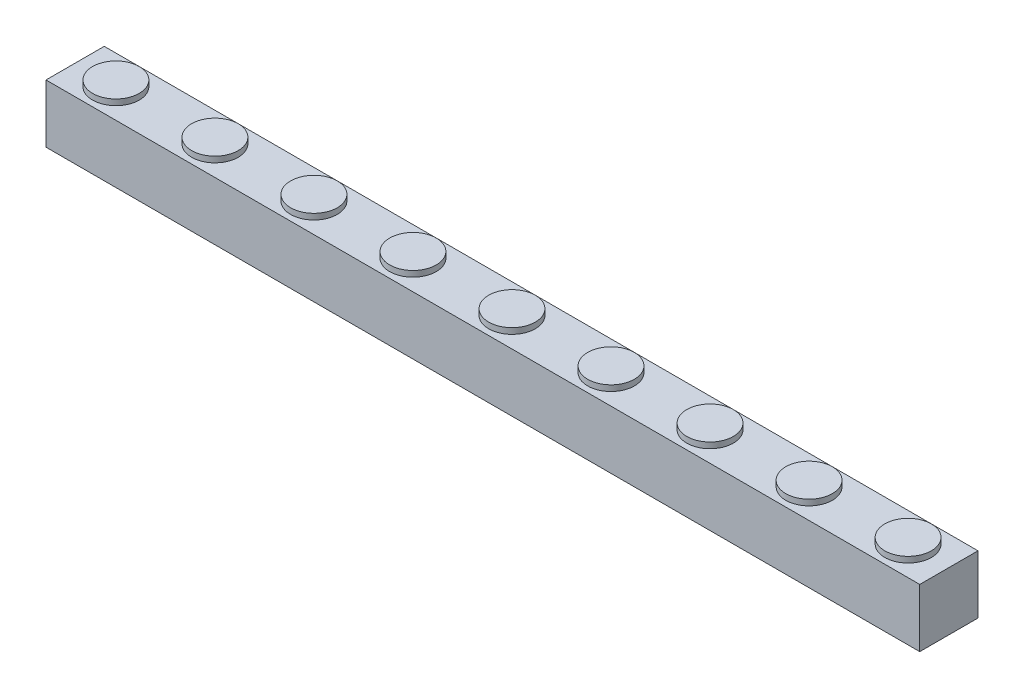
ISO-10303-21;
HEADER;
FILE_DESCRIPTION(('STEP AP214'),'2;1');
FILE_NAME('part.step','',(''),(''),'','','');
FILE_SCHEMA(('AUTOMOTIVE_DESIGN { 1 0 10303 214 1 1 1 1 }'));
ENDSEC;
DATA;
#1=APPLICATION_CONTEXT('core data for automotive mechanical design processes');
#2=APPLICATION_PROTOCOL_DEFINITION('international standard','automotive_design',2000,#1);
#3=PRODUCT_CONTEXT('',#1,'mechanical');
#4=PRODUCT('Part','Part','',(#3));
#5=PRODUCT_RELATED_PRODUCT_CATEGORY('part','',(#4));
#6=PRODUCT_DEFINITION_FORMATION('','',#4);
#7=PRODUCT_DEFINITION_CONTEXT('part definition',#1,'design');
#8=PRODUCT_DEFINITION('design','',#6,#7);
#9=PRODUCT_DEFINITION_SHAPE('','',#8);
#10=(LENGTH_UNIT() NAMED_UNIT(*) SI_UNIT(.MILLI.,.METRE.));
#11=(NAMED_UNIT(*) PLANE_ANGLE_UNIT() SI_UNIT($,.RADIAN.));
#12=(NAMED_UNIT(*) SI_UNIT($,.STERADIAN.) SOLID_ANGLE_UNIT());
#13=UNCERTAINTY_MEASURE_WITH_UNIT(LENGTH_MEASURE(1.E-05),#10,'distance_accuracy_value','');
#14=(GEOMETRIC_REPRESENTATION_CONTEXT(3) GLOBAL_UNCERTAINTY_ASSIGNED_CONTEXT((#13)) GLOBAL_UNIT_ASSIGNED_CONTEXT((#10,
#11,#12)) REPRESENTATION_CONTEXT('',''));
#15=CARTESIAN_POINT('',(0.,0.,0.));
#16=DIRECTION('',(0.,0.,1.));
#17=DIRECTION('',(1.,0.,0.));
#18=AXIS2_PLACEMENT_3D('',#15,#16,#17);
#19=CARTESIAN_POINT('',(75.,10.,5.));
#20=DIRECTION('',(-1.,0.,0.));
#21=DIRECTION('',(0.,0.,1.));
#22=AXIS2_PLACEMENT_3D('',#19,#20,#21);
#23=PLANE('',#22);
#24=DIRECTION('',(0.,0.,-1.));
#25=VECTOR('',#24,1.);
#26=CARTESIAN_POINT('',(75.,0.,5.));
#27=LINE('',#26,#25);
#28=CARTESIAN_POINT('',(75.,0.,5.));
#29=VERTEX_POINT('',#28);
#30=CARTESIAN_POINT('',(75.,0.,-5.));
#31=VERTEX_POINT('',#30);
#32=EDGE_CURVE('E111',#29,#31,#27,.T.);
#33=ORIENTED_EDGE('',*,*,#32,.T.);
#34=DIRECTION('',(0.,-1.,0.));
#35=VECTOR('',#34,1.);
#36=CARTESIAN_POINT('',(75.,10.,-5.));
#37=LINE('',#36,#35);
#38=CARTESIAN_POINT('',(75.,10.,-5.));
#39=VERTEX_POINT('',#38);
#40=EDGE_CURVE('E100',#39,#31,#37,.T.);
#41=ORIENTED_EDGE('',*,*,#40,.F.);
#42=DIRECTION('',(0.,0.,-1.));
#43=VECTOR('',#42,1.);
#44=CARTESIAN_POINT('',(75.,10.,5.));
#45=LINE('',#44,#43);
#46=CARTESIAN_POINT('',(75.,10.,5.));
#47=VERTEX_POINT('',#46);
#48=EDGE_CURVE('E92',#47,#39,#45,.T.);
#49=ORIENTED_EDGE('',*,*,#48,.F.);
#50=DIRECTION('',(0.,-1.,0.));
#51=VECTOR('',#50,1.);
#52=CARTESIAN_POINT('',(75.,10.,5.));
#53=LINE('',#52,#51);
#54=EDGE_CURVE('E107',#47,#29,#53,.T.);
#55=ORIENTED_EDGE('',*,*,#54,.T.);
#56=EDGE_LOOP('',(#33,#41,#49,#55));
#57=FACE_BOUND('',#56,.T.);
#58=ADVANCED_FACE('F39',(#57),#23,.F.);
#59=CARTESIAN_POINT('',(-75.,10.,-5.));
#60=DIRECTION('',(0.,0.,1.));
#61=DIRECTION('',(1.,0.,0.));
#62=AXIS2_PLACEMENT_3D('',#59,#60,#61);
#63=PLANE('',#62);
#64=DIRECTION('',(-1.,0.,0.));
#65=VECTOR('',#64,1.);
#66=CARTESIAN_POINT('',(-75.,0.,-5.));
#67=LINE('',#66,#65);
#68=CARTESIAN_POINT('',(-75.,0.,-5.));
#69=VERTEX_POINT('',#68);
#70=EDGE_CURVE('E98',#31,#69,#67,.T.);
#71=ORIENTED_EDGE('',*,*,#70,.T.);
#72=DIRECTION('',(0.,-1.,0.));
#73=VECTOR('',#72,1.);
#74=CARTESIAN_POINT('',(-75.,10.,-5.));
#75=LINE('',#74,#73);
#76=CARTESIAN_POINT('',(-75.,10.,-5.));
#77=VERTEX_POINT('',#76);
#78=EDGE_CURVE('E96',#77,#69,#75,.T.);
#79=ORIENTED_EDGE('',*,*,#78,.F.);
#80=DIRECTION('',(-1.,0.,0.));
#81=VECTOR('',#80,1.);
#82=CARTESIAN_POINT('',(-75.,10.,-5.));
#83=LINE('',#82,#81);
#84=EDGE_CURVE('E87',#39,#77,#83,.T.);
#85=ORIENTED_EDGE('',*,*,#84,.F.);
#86=ORIENTED_EDGE('',*,*,#40,.T.);
#87=EDGE_LOOP('',(#71,#79,#85,#86));
#88=FACE_BOUND('',#87,.T.);
#89=ADVANCED_FACE('F97',(#88),#63,.F.);
#90=CARTESIAN_POINT('',(-75.,10.,5.));
#91=DIRECTION('',(1.,0.,0.));
#92=DIRECTION('',(0.,0.,-1.));
#93=AXIS2_PLACEMENT_3D('',#90,#91,#92);
#94=PLANE('',#93);
#95=DIRECTION('',(0.,0.,1.));
#96=VECTOR('',#95,1.);
#97=CARTESIAN_POINT('',(-75.,0.,5.));
#98=LINE('',#97,#96);
#99=CARTESIAN_POINT('',(-75.,0.,5.));
#100=VERTEX_POINT('',#99);
#101=EDGE_CURVE('E73',#69,#100,#98,.T.);
#102=ORIENTED_EDGE('',*,*,#101,.T.);
#103=DIRECTION('',(0.,-1.,0.));
#104=VECTOR('',#103,1.);
#105=CARTESIAN_POINT('',(-75.,10.,5.));
#106=LINE('',#105,#104);
#107=CARTESIAN_POINT('',(-75.,10.,5.));
#108=VERTEX_POINT('',#107);
#109=EDGE_CURVE('E101',#108,#100,#106,.T.);
#110=ORIENTED_EDGE('',*,*,#109,.F.);
#111=DIRECTION('',(0.,0.,1.));
#112=VECTOR('',#111,1.);
#113=CARTESIAN_POINT('',(-75.,10.,5.));
#114=LINE('',#113,#112);
#115=EDGE_CURVE('E90',#77,#108,#114,.T.);
#116=ORIENTED_EDGE('',*,*,#115,.F.);
#117=ORIENTED_EDGE('',*,*,#78,.T.);
#118=EDGE_LOOP('',(#102,#110,#116,#117));
#119=FACE_BOUND('',#118,.T.);
#120=ADVANCED_FACE('F103',(#119),#94,.F.);
#121=CARTESIAN_POINT('',(-75.,10.,5.));
#122=DIRECTION('',(0.,0.,-1.));
#123=DIRECTION('',(-1.,0.,0.));
#124=AXIS2_PLACEMENT_3D('',#121,#122,#123);
#125=PLANE('',#124);
#126=DIRECTION('',(1.,0.,0.));
#127=VECTOR('',#126,1.);
#128=CARTESIAN_POINT('',(-75.,0.,5.));
#129=LINE('',#128,#127);
#130=EDGE_CURVE('E79',#100,#29,#129,.T.);
#131=ORIENTED_EDGE('',*,*,#130,.T.);
#132=ORIENTED_EDGE('',*,*,#54,.F.);
#133=DIRECTION('',(1.,0.,0.));
#134=VECTOR('',#133,1.);
#135=CARTESIAN_POINT('',(-75.,10.,5.));
#136=LINE('',#135,#134);
#137=EDGE_CURVE('E56',#108,#47,#136,.T.);
#138=ORIENTED_EDGE('',*,*,#137,.F.);
#139=ORIENTED_EDGE('',*,*,#109,.T.);
#140=EDGE_LOOP('',(#131,#132,#138,#139));
#141=FACE_BOUND('',#140,.T.);
#142=ADVANCED_FACE('F164',(#141),#125,.F.);
#143=CARTESIAN_POINT('',(0.,10.,0.));
#144=DIRECTION('',(0.,-1.,0.));
#145=DIRECTION('',(0.,0.,-1.));
#146=AXIS2_PLACEMENT_3D('',#143,#144,#145);
#147=PLANE('',#146);
#148=CARTESIAN_POINT('',(-68.,10.,4.74841462082666E-13));
#149=DIRECTION('',(0.,-1.,0.));
#150=DIRECTION('',(0.,0.,-1.));
#151=AXIS2_PLACEMENT_3D('',#148,#149,#150);
#152=CIRCLE('',#151,4.00000000000001);
#153=CARTESIAN_POINT('',(-68.,10.,-3.99999999999953));
#154=VERTEX_POINT('',#153);
#155=EDGE_CURVE('E11',#154,#154,#152,.F.);
#156=ORIENTED_EDGE('',*,*,#155,.F.);
#157=EDGE_LOOP('',(#156));
#158=FACE_BOUND('',#157,.T.);
#159=CARTESIAN_POINT('',(-51.,10.,3.56131096562E-13));
#160=DIRECTION('',(0.,-1.,0.));
#161=DIRECTION('',(0.,0.,-1.));
#162=AXIS2_PLACEMENT_3D('',#159,#160,#161);
#163=CIRCLE('',#162,4.);
#164=CARTESIAN_POINT('',(-51.,10.,-3.99999999999964));
#165=VERTEX_POINT('',#164);
#166=EDGE_CURVE('E48',#165,#165,#163,.F.);
#167=ORIENTED_EDGE('',*,*,#166,.F.);
#168=EDGE_LOOP('',(#167));
#169=FACE_BOUND('',#168,.T.);
#170=CARTESIAN_POINT('',(-34.,10.,2.37420731041333E-13));
#171=DIRECTION('',(0.,-1.,0.));
#172=DIRECTION('',(0.,0.,-1.));
#173=AXIS2_PLACEMENT_3D('',#170,#171,#172);
#174=CIRCLE('',#173,4.);
#175=CARTESIAN_POINT('',(-34.,10.,-3.99999999999976));
#176=VERTEX_POINT('',#175);
#177=EDGE_CURVE('E152',#176,#176,#174,.F.);
#178=ORIENTED_EDGE('',*,*,#177,.F.);
#179=EDGE_LOOP('',(#178));
#180=FACE_BOUND('',#179,.T.);
#181=CARTESIAN_POINT('',(-17.,10.,1.18710365520667E-13));
#182=DIRECTION('',(0.,-1.,0.));
#183=DIRECTION('',(0.,0.,-1.));
#184=AXIS2_PLACEMENT_3D('',#181,#182,#183);
#185=CIRCLE('',#184,4.);
#186=CARTESIAN_POINT('',(-17.,10.,-3.99999999999988));
#187=VERTEX_POINT('',#186);
#188=EDGE_CURVE('E148',#187,#187,#185,.F.);
#189=ORIENTED_EDGE('',*,*,#188,.F.);
#190=EDGE_LOOP('',(#189));
#191=FACE_BOUND('',#190,.T.);
#192=CARTESIAN_POINT('',(68.,10.,0.));
#193=DIRECTION('',(0.,-1.,0.));
#194=DIRECTION('',(0.,0.,-1.));
#195=AXIS2_PLACEMENT_3D('',#192,#193,#194);
#196=CIRCLE('',#195,4.00000000000001);
#197=CARTESIAN_POINT('',(68.,10.,-4.00000000000001));
#198=VERTEX_POINT('',#197);
#199=EDGE_CURVE('E144',#198,#198,#196,.F.);
#200=ORIENTED_EDGE('',*,*,#199,.F.);
#201=EDGE_LOOP('',(#200));
#202=FACE_BOUND('',#201,.T.);
#203=CARTESIAN_POINT('',(51.,10.,0.));
#204=DIRECTION('',(0.,-1.,0.));
#205=DIRECTION('',(0.,0.,-1.));
#206=AXIS2_PLACEMENT_3D('',#203,#204,#205);
#207=CIRCLE('',#206,4.);
#208=CARTESIAN_POINT('',(51.,10.,-4.));
#209=VERTEX_POINT('',#208);
#210=EDGE_CURVE('E140',#209,#209,#207,.F.);
#211=ORIENTED_EDGE('',*,*,#210,.F.);
#212=EDGE_LOOP('',(#211));
#213=FACE_BOUND('',#212,.T.);
#214=CARTESIAN_POINT('',(34.,10.,0.));
#215=DIRECTION('',(0.,-1.,0.));
#216=DIRECTION('',(0.,0.,-1.));
#217=AXIS2_PLACEMENT_3D('',#214,#215,#216);
#218=CIRCLE('',#217,4.);
#219=CARTESIAN_POINT('',(34.,10.,-4.));
#220=VERTEX_POINT('',#219);
#221=EDGE_CURVE('E136',#220,#220,#218,.F.);
#222=ORIENTED_EDGE('',*,*,#221,.F.);
#223=EDGE_LOOP('',(#222));
#224=FACE_BOUND('',#223,.T.);
#225=CARTESIAN_POINT('',(17.,10.,0.));
#226=DIRECTION('',(0.,-1.,0.));
#227=DIRECTION('',(0.,0.,-1.));
#228=AXIS2_PLACEMENT_3D('',#225,#226,#227);
#229=CIRCLE('',#228,4.);
#230=CARTESIAN_POINT('',(17.,10.,-4.));
#231=VERTEX_POINT('',#230);
#232=EDGE_CURVE('E132',#231,#231,#229,.F.);
#233=ORIENTED_EDGE('',*,*,#232,.F.);
#234=EDGE_LOOP('',(#233));
#235=FACE_BOUND('',#234,.T.);
#236=CARTESIAN_POINT('',(0.,10.,0.));
#237=DIRECTION('',(0.,-1.,0.));
#238=DIRECTION('',(0.,0.,-1.));
#239=AXIS2_PLACEMENT_3D('',#236,#237,#238);
#240=CIRCLE('',#239,4.);
#241=CARTESIAN_POINT('',(0.,10.,-4.));
#242=VERTEX_POINT('',#241);
#243=EDGE_CURVE('E128',#242,#242,#240,.F.);
#244=ORIENTED_EDGE('',*,*,#243,.F.);
#245=EDGE_LOOP('',(#244));
#246=FACE_BOUND('',#245,.T.);
#247=ORIENTED_EDGE('',*,*,#48,.T.);
#248=ORIENTED_EDGE('',*,*,#84,.T.);
#249=ORIENTED_EDGE('',*,*,#115,.T.);
#250=ORIENTED_EDGE('',*,*,#137,.T.);
#251=EDGE_LOOP('',(#247,#248,#249,#250));
#252=FACE_BOUND('',#251,.T.);
#253=ADVANCED_FACE('F88',(#158,#169,#180,#191,#202,#213,#224,#235,#246,#252),#147,.F.);
#254=CARTESIAN_POINT('',(0.,0.,0.));
#255=DIRECTION('',(0.,-1.,0.));
#256=DIRECTION('',(0.,0.,-1.));
#257=AXIS2_PLACEMENT_3D('',#254,#255,#256);
#258=PLANE('',#257);
#259=ORIENTED_EDGE('',*,*,#32,.F.);
#260=ORIENTED_EDGE('',*,*,#130,.F.);
#261=ORIENTED_EDGE('',*,*,#101,.F.);
#262=ORIENTED_EDGE('',*,*,#70,.F.);
#263=EDGE_LOOP('',(#259,#260,#261,#262));
#264=FACE_BOUND('',#263,.T.);
#265=ADVANCED_FACE('F163',(#264),#258,.T.);
#266=CARTESIAN_POINT('',(0.,11.,0.));
#267=DIRECTION('',(0.,-1.,0.));
#268=DIRECTION('',(0.,0.,-1.));
#269=AXIS2_PLACEMENT_3D('',#266,#267,#268);
#270=CYLINDRICAL_SURFACE('',#269,4.);
#271=CARTESIAN_POINT('',(0.,11.,0.));
#272=DIRECTION('',(0.,1.,0.));
#273=DIRECTION('',(0.,0.,1.));
#274=AXIS2_PLACEMENT_3D('',#271,#272,#273);
#275=CIRCLE('',#274,4.);
#276=CARTESIAN_POINT('',(0.,11.,4.));
#277=VERTEX_POINT('',#276);
#278=EDGE_CURVE('E115',#277,#277,#275,.T.);
#279=ORIENTED_EDGE('',*,*,#278,.F.);
#280=EDGE_LOOP('',(#279));
#281=FACE_BOUND('',#280,.T.);
#282=ORIENTED_EDGE('',*,*,#243,.T.);
#283=EDGE_LOOP('',(#282));
#284=FACE_BOUND('',#283,.T.);
#285=ADVANCED_FACE('F181',(#281,#284),#270,.T.);
#286=CARTESIAN_POINT('',(0.,11.,0.));
#287=DIRECTION('',(0.,1.,0.));
#288=DIRECTION('',(0.,0.,1.));
#289=AXIS2_PLACEMENT_3D('',#286,#287,#288);
#290=PLANE('',#289);
#291=ORIENTED_EDGE('',*,*,#278,.T.);
#292=EDGE_LOOP('',(#291));
#293=FACE_BOUND('',#292,.T.);
#294=ADVANCED_FACE('F183',(#293),#290,.T.);
#295=CARTESIAN_POINT('',(17.,11.,0.));
#296=DIRECTION('',(0.,-1.,0.));
#297=DIRECTION('',(0.,0.,-1.));
#298=AXIS2_PLACEMENT_3D('',#295,#296,#297);
#299=CYLINDRICAL_SURFACE('',#298,4.);
#300=CARTESIAN_POINT('',(17.,11.,0.));
#301=DIRECTION('',(0.,1.,0.));
#302=DIRECTION('',(0.,0.,1.));
#303=AXIS2_PLACEMENT_3D('',#300,#301,#302);
#304=CIRCLE('',#303,4.);
#305=CARTESIAN_POINT('',(17.,11.,4.));
#306=VERTEX_POINT('',#305);
#307=EDGE_CURVE('E436',#306,#306,#304,.T.);
#308=ORIENTED_EDGE('',*,*,#307,.F.);
#309=EDGE_LOOP('',(#308));
#310=FACE_BOUND('',#309,.T.);
#311=ORIENTED_EDGE('',*,*,#232,.T.);
#312=EDGE_LOOP('',(#311));
#313=FACE_BOUND('',#312,.T.);
#314=ADVANCED_FACE('F190',(#310,#313),#299,.T.);
#315=CARTESIAN_POINT('',(17.,11.,0.));
#316=DIRECTION('',(0.,1.,0.));
#317=DIRECTION('',(0.,0.,1.));
#318=AXIS2_PLACEMENT_3D('',#315,#316,#317);
#319=PLANE('',#318);
#320=ORIENTED_EDGE('',*,*,#307,.T.);
#321=EDGE_LOOP('',(#320));
#322=FACE_BOUND('',#321,.T.);
#323=ADVANCED_FACE('F253',(#322),#319,.T.);
#324=CARTESIAN_POINT('',(34.,11.,0.));
#325=DIRECTION('',(0.,-1.,0.));
#326=DIRECTION('',(0.,0.,-1.));
#327=AXIS2_PLACEMENT_3D('',#324,#325,#326);
#328=CYLINDRICAL_SURFACE('',#327,4.);
#329=CARTESIAN_POINT('',(34.,11.,0.));
#330=DIRECTION('',(0.,1.,0.));
#331=DIRECTION('',(0.,0.,1.));
#332=AXIS2_PLACEMENT_3D('',#329,#330,#331);
#333=CIRCLE('',#332,4.);
#334=CARTESIAN_POINT('',(34.,11.,4.));
#335=VERTEX_POINT('',#334);
#336=EDGE_CURVE('E432',#335,#335,#333,.T.);
#337=ORIENTED_EDGE('',*,*,#336,.F.);
#338=EDGE_LOOP('',(#337));
#339=FACE_BOUND('',#338,.T.);
#340=ORIENTED_EDGE('',*,*,#221,.T.);
#341=EDGE_LOOP('',(#340));
#342=FACE_BOUND('',#341,.T.);
#343=ADVANCED_FACE('F262',(#339,#342),#328,.T.);
#344=CARTESIAN_POINT('',(34.,11.,0.));
#345=DIRECTION('',(0.,1.,0.));
#346=DIRECTION('',(0.,0.,1.));
#347=AXIS2_PLACEMENT_3D('',#344,#345,#346);
#348=PLANE('',#347);
#349=ORIENTED_EDGE('',*,*,#336,.T.);
#350=EDGE_LOOP('',(#349));
#351=FACE_BOUND('',#350,.T.);
#352=ADVANCED_FACE('F271',(#351),#348,.T.);
#353=CARTESIAN_POINT('',(51.,11.,0.));
#354=DIRECTION('',(0.,-1.,0.));
#355=DIRECTION('',(0.,0.,-1.));
#356=AXIS2_PLACEMENT_3D('',#353,#354,#355);
#357=CYLINDRICAL_SURFACE('',#356,4.);
#358=CARTESIAN_POINT('',(51.,11.,0.));
#359=DIRECTION('',(0.,1.,0.));
#360=DIRECTION('',(0.,0.,1.));
#361=AXIS2_PLACEMENT_3D('',#358,#359,#360);
#362=CIRCLE('',#361,4.);
#363=CARTESIAN_POINT('',(51.,11.,4.));
#364=VERTEX_POINT('',#363);
#365=EDGE_CURVE('E428',#364,#364,#362,.T.);
#366=ORIENTED_EDGE('',*,*,#365,.F.);
#367=EDGE_LOOP('',(#366));
#368=FACE_BOUND('',#367,.T.);
#369=ORIENTED_EDGE('',*,*,#210,.T.);
#370=EDGE_LOOP('',(#369));
#371=FACE_BOUND('',#370,.T.);
#372=ADVANCED_FACE('F280',(#368,#371),#357,.T.);
#373=CARTESIAN_POINT('',(51.,11.,0.));
#374=DIRECTION('',(0.,1.,0.));
#375=DIRECTION('',(0.,0.,1.));
#376=AXIS2_PLACEMENT_3D('',#373,#374,#375);
#377=PLANE('',#376);
#378=ORIENTED_EDGE('',*,*,#365,.T.);
#379=EDGE_LOOP('',(#378));
#380=FACE_BOUND('',#379,.T.);
#381=ADVANCED_FACE('F289',(#380),#377,.T.);
#382=CARTESIAN_POINT('',(68.,11.,0.));
#383=DIRECTION('',(0.,-1.,0.));
#384=DIRECTION('',(0.,0.,-1.));
#385=AXIS2_PLACEMENT_3D('',#382,#383,#384);
#386=CYLINDRICAL_SURFACE('',#385,4.00000000000001);
#387=CARTESIAN_POINT('',(68.,11.,0.));
#388=DIRECTION('',(0.,1.,0.));
#389=DIRECTION('',(0.,0.,1.));
#390=AXIS2_PLACEMENT_3D('',#387,#388,#389);
#391=CIRCLE('',#390,4.00000000000001);
#392=CARTESIAN_POINT('',(68.,11.,4.00000000000001));
#393=VERTEX_POINT('',#392);
#394=EDGE_CURVE('E424',#393,#393,#391,.T.);
#395=ORIENTED_EDGE('',*,*,#394,.F.);
#396=EDGE_LOOP('',(#395));
#397=FACE_BOUND('',#396,.T.);
#398=ORIENTED_EDGE('',*,*,#199,.T.);
#399=EDGE_LOOP('',(#398));
#400=FACE_BOUND('',#399,.T.);
#401=ADVANCED_FACE('F298',(#397,#400),#386,.T.);
#402=CARTESIAN_POINT('',(68.,11.,0.));
#403=DIRECTION('',(0.,1.,0.));
#404=DIRECTION('',(0.,0.,1.));
#405=AXIS2_PLACEMENT_3D('',#402,#403,#404);
#406=PLANE('',#405);
#407=ORIENTED_EDGE('',*,*,#394,.T.);
#408=EDGE_LOOP('',(#407));
#409=FACE_BOUND('',#408,.T.);
#410=ADVANCED_FACE('F307',(#409),#406,.T.);
#411=CARTESIAN_POINT('',(-17.,11.,1.18710365520667E-13));
#412=DIRECTION('',(0.,-1.,0.));
#413=DIRECTION('',(0.,0.,-1.));
#414=AXIS2_PLACEMENT_3D('',#411,#412,#413);
#415=CYLINDRICAL_SURFACE('',#414,4.);
#416=CARTESIAN_POINT('',(-17.,11.,1.18710365520667E-13));
#417=DIRECTION('',(0.,1.,0.));
#418=DIRECTION('',(0.,0.,1.));
#419=AXIS2_PLACEMENT_3D('',#416,#417,#418);
#420=CIRCLE('',#419,4.);
#421=CARTESIAN_POINT('',(-17.,11.,4.00000000000012));
#422=VERTEX_POINT('',#421);
#423=EDGE_CURVE('E420',#422,#422,#420,.T.);
#424=ORIENTED_EDGE('',*,*,#423,.F.);
#425=EDGE_LOOP('',(#424));
#426=FACE_BOUND('',#425,.T.);
#427=ORIENTED_EDGE('',*,*,#188,.T.);
#428=EDGE_LOOP('',(#427));
#429=FACE_BOUND('',#428,.T.);
#430=ADVANCED_FACE('F316',(#426,#429),#415,.T.);
#431=CARTESIAN_POINT('',(-17.,11.,1.18710365520667E-13));
#432=DIRECTION('',(0.,1.,0.));
#433=DIRECTION('',(0.,0.,1.));
#434=AXIS2_PLACEMENT_3D('',#431,#432,#433);
#435=PLANE('',#434);
#436=ORIENTED_EDGE('',*,*,#423,.T.);
#437=EDGE_LOOP('',(#436));
#438=FACE_BOUND('',#437,.T.);
#439=ADVANCED_FACE('F325',(#438),#435,.T.);
#440=CARTESIAN_POINT('',(-34.,11.,2.37420731041333E-13));
#441=DIRECTION('',(0.,-1.,0.));
#442=DIRECTION('',(0.,0.,-1.));
#443=AXIS2_PLACEMENT_3D('',#440,#441,#442);
#444=CYLINDRICAL_SURFACE('',#443,4.);
#445=CARTESIAN_POINT('',(-34.,11.,2.37420731041333E-13));
#446=DIRECTION('',(0.,1.,0.));
#447=DIRECTION('',(0.,0.,1.));
#448=AXIS2_PLACEMENT_3D('',#445,#446,#447);
#449=CIRCLE('',#448,4.);
#450=CARTESIAN_POINT('',(-34.,11.,4.00000000000024));
#451=VERTEX_POINT('',#450);
#452=EDGE_CURVE('E414',#451,#451,#449,.T.);
#453=ORIENTED_EDGE('',*,*,#452,.F.);
#454=EDGE_LOOP('',(#453));
#455=FACE_BOUND('',#454,.T.);
#456=ORIENTED_EDGE('',*,*,#177,.T.);
#457=EDGE_LOOP('',(#456));
#458=FACE_BOUND('',#457,.T.);
#459=ADVANCED_FACE('F334',(#455,#458),#444,.T.);
#460=CARTESIAN_POINT('',(-34.,11.,2.37420731041333E-13));
#461=DIRECTION('',(0.,1.,0.));
#462=DIRECTION('',(0.,0.,1.));
#463=AXIS2_PLACEMENT_3D('',#460,#461,#462);
#464=PLANE('',#463);
#465=ORIENTED_EDGE('',*,*,#452,.T.);
#466=EDGE_LOOP('',(#465));
#467=FACE_BOUND('',#466,.T.);
#468=ADVANCED_FACE('F343',(#467),#464,.T.);
#469=CARTESIAN_POINT('',(-51.,11.,3.56131096562E-13));
#470=DIRECTION('',(0.,-1.,0.));
#471=DIRECTION('',(0.,0.,-1.));
#472=AXIS2_PLACEMENT_3D('',#469,#470,#471);
#473=CYLINDRICAL_SURFACE('',#472,4.);
#474=CARTESIAN_POINT('',(-51.,11.,3.56131096562E-13));
#475=DIRECTION('',(0.,1.,0.));
#476=DIRECTION('',(0.,0.,1.));
#477=AXIS2_PLACEMENT_3D('',#474,#475,#476);
#478=CIRCLE('',#477,4.);
#479=CARTESIAN_POINT('',(-51.,11.,4.00000000000036));
#480=VERTEX_POINT('',#479);
#481=EDGE_CURVE('E410',#480,#480,#478,.T.);
#482=ORIENTED_EDGE('',*,*,#481,.F.);
#483=EDGE_LOOP('',(#482));
#484=FACE_BOUND('',#483,.T.);
#485=ORIENTED_EDGE('',*,*,#166,.T.);
#486=EDGE_LOOP('',(#485));
#487=FACE_BOUND('',#486,.T.);
#488=ADVANCED_FACE('F159',(#484,#487),#473,.T.);
#489=CARTESIAN_POINT('',(-51.,11.,3.56131096562E-13));
#490=DIRECTION('',(0.,1.,0.));
#491=DIRECTION('',(0.,0.,1.));
#492=AXIS2_PLACEMENT_3D('',#489,#490,#491);
#493=PLANE('',#492);
#494=ORIENTED_EDGE('',*,*,#481,.T.);
#495=EDGE_LOOP('',(#494));
#496=FACE_BOUND('',#495,.T.);
#497=ADVANCED_FACE('F360',(#496),#493,.T.);
#498=CARTESIAN_POINT('',(-68.,11.,4.74841462082666E-13));
#499=DIRECTION('',(0.,-1.,0.));
#500=DIRECTION('',(0.,0.,-1.));
#501=AXIS2_PLACEMENT_3D('',#498,#499,#500);
#502=CYLINDRICAL_SURFACE('',#501,4.00000000000001);
#503=CARTESIAN_POINT('',(-68.,11.,4.74841462082666E-13));
#504=DIRECTION('',(0.,1.,0.));
#505=DIRECTION('',(0.,0.,1.));
#506=AXIS2_PLACEMENT_3D('',#503,#504,#505);
#507=CIRCLE('',#506,4.00000000000001);
#508=CARTESIAN_POINT('',(-68.,11.,4.00000000000048));
#509=VERTEX_POINT('',#508);
#510=EDGE_CURVE('E408',#509,#509,#507,.T.);
#511=ORIENTED_EDGE('',*,*,#510,.F.);
#512=EDGE_LOOP('',(#511));
#513=FACE_BOUND('',#512,.T.);
#514=ORIENTED_EDGE('',*,*,#155,.T.);
#515=EDGE_LOOP('',(#514));
#516=FACE_BOUND('',#515,.T.);
#517=ADVANCED_FACE('F369',(#513,#516),#502,.T.);
#518=CARTESIAN_POINT('',(-68.,11.,4.74841462082666E-13));
#519=DIRECTION('',(0.,1.,0.));
#520=DIRECTION('',(0.,0.,1.));
#521=AXIS2_PLACEMENT_3D('',#518,#519,#520);
#522=PLANE('',#521);
#523=ORIENTED_EDGE('',*,*,#510,.T.);
#524=EDGE_LOOP('',(#523));
#525=FACE_BOUND('',#524,.T.);
#526=ADVANCED_FACE('F378',(#525),#522,.T.);
#527=CLOSED_SHELL('',(#58,#89,#120,#142,#253,#265,#285,#294,#314,#323,#343,#352,#372,#381,#401,
#410,#430,#439,#459,#468,#488,#497,#517,#526));
#528=MANIFOLD_SOLID_BREP('B2',#527);
#529=ADVANCED_BREP_SHAPE_REPRESENTATION('',(#18,#528),#14);
#530=SHAPE_DEFINITION_REPRESENTATION(#9,#529);
ENDSEC;
END-ISO-10303-21;
